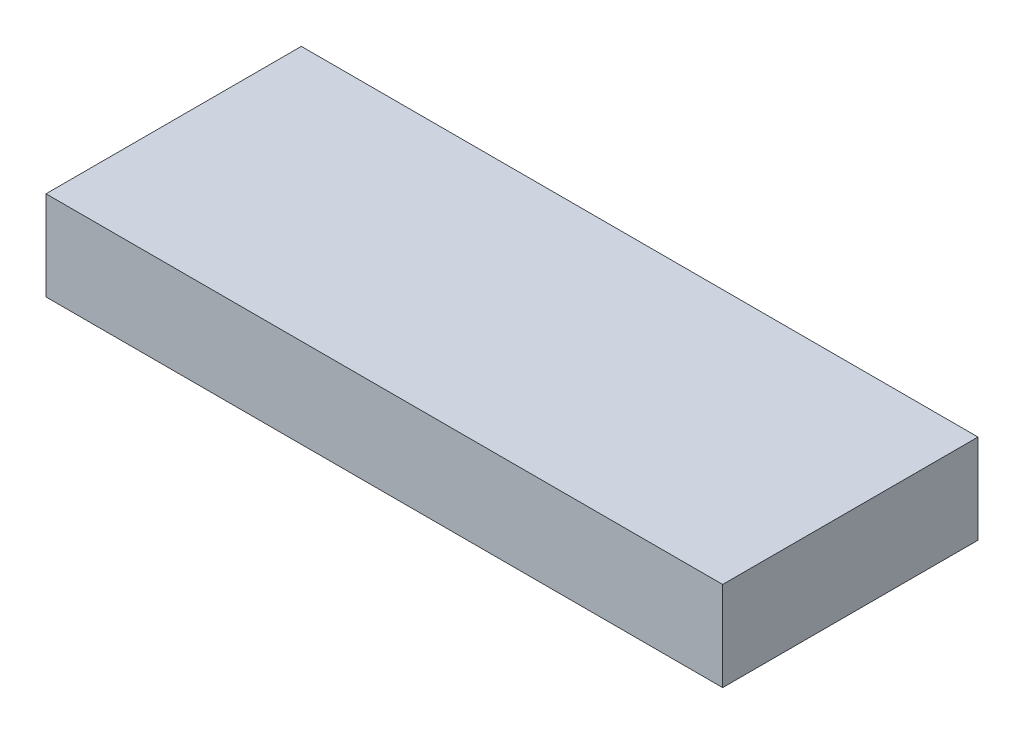
ISO-10303-21;
HEADER;
FILE_DESCRIPTION(('STEP AP214'),'2;1');
FILE_NAME('part.step','',(''),(''),'','','');
FILE_SCHEMA(('AUTOMOTIVE_DESIGN { 1 0 10303 214 1 1 1 1 }'));
ENDSEC;
DATA;
#1=APPLICATION_CONTEXT('core data for automotive mechanical design processes');
#2=APPLICATION_PROTOCOL_DEFINITION('international standard','automotive_design',2000,#1);
#3=PRODUCT_CONTEXT('',#1,'mechanical');
#4=PRODUCT('Part','Part','',(#3));
#5=PRODUCT_RELATED_PRODUCT_CATEGORY('part','',(#4));
#6=PRODUCT_DEFINITION_FORMATION('','',#4);
#7=PRODUCT_DEFINITION_CONTEXT('part definition',#1,'design');
#8=PRODUCT_DEFINITION('design','',#6,#7);
#9=PRODUCT_DEFINITION_SHAPE('','',#8);
#10=(LENGTH_UNIT() NAMED_UNIT(*) SI_UNIT(.MILLI.,.METRE.));
#11=(NAMED_UNIT(*) PLANE_ANGLE_UNIT() SI_UNIT($,.RADIAN.));
#12=(NAMED_UNIT(*) SI_UNIT($,.STERADIAN.) SOLID_ANGLE_UNIT());
#13=UNCERTAINTY_MEASURE_WITH_UNIT(LENGTH_MEASURE(1.E-05),#10,'distance_accuracy_value','');
#14=(GEOMETRIC_REPRESENTATION_CONTEXT(3) GLOBAL_UNCERTAINTY_ASSIGNED_CONTEXT((#13)) GLOBAL_UNIT_ASSIGNED_CONTEXT((#10,
#11,#12)) REPRESENTATION_CONTEXT('',''));
#15=CARTESIAN_POINT('',(0.,0.,0.));
#16=DIRECTION('',(0.,0.,1.));
#17=DIRECTION('',(1.,0.,0.));
#18=AXIS2_PLACEMENT_3D('',#15,#16,#17);
#19=CARTESIAN_POINT('',(0.,22.225,0.));
#20=DIRECTION('',(-1.,0.,0.));
#21=DIRECTION('',(0.,0.,1.));
#22=AXIS2_PLACEMENT_3D('',#19,#20,#21);
#23=PLANE('',#22);
#24=DIRECTION('',(0.,0.,-1.));
#25=VECTOR('',#24,1.);
#26=CARTESIAN_POINT('',(0.,0.,0.));
#27=LINE('',#26,#25);
#28=CARTESIAN_POINT('',(0.,0.,0.));
#29=VERTEX_POINT('',#28);
#30=CARTESIAN_POINT('',(0.,0.,-63.5));
#31=VERTEX_POINT('',#30);
#32=EDGE_CURVE('E98',#29,#31,#27,.T.);
#33=ORIENTED_EDGE('',*,*,#32,.F.);
#34=DIRECTION('',(0.,-1.,0.));
#35=VECTOR('',#34,1.);
#36=CARTESIAN_POINT('',(0.,22.225,0.));
#37=LINE('',#36,#35);
#38=CARTESIAN_POINT('',(0.,22.225,0.));
#39=VERTEX_POINT('',#38);
#40=EDGE_CURVE('E11',#39,#29,#37,.T.);
#41=ORIENTED_EDGE('',*,*,#40,.F.);
#42=DIRECTION('',(0.,0.,-1.));
#43=VECTOR('',#42,1.);
#44=CARTESIAN_POINT('',(0.,22.225,0.));
#45=LINE('',#44,#43);
#46=CARTESIAN_POINT('',(0.,22.225,-63.5));
#47=VERTEX_POINT('',#46);
#48=EDGE_CURVE('E93',#39,#47,#45,.T.);
#49=ORIENTED_EDGE('',*,*,#48,.T.);
#50=DIRECTION('',(0.,-1.,0.));
#51=VECTOR('',#50,1.);
#52=CARTESIAN_POINT('',(0.,22.225,-63.5));
#53=LINE('',#52,#51);
#54=EDGE_CURVE('E36',#47,#31,#53,.T.);
#55=ORIENTED_EDGE('',*,*,#54,.T.);
#56=EDGE_LOOP('',(#33,#41,#49,#55));
#57=FACE_BOUND('',#56,.T.);
#58=ADVANCED_FACE('F33',(#57),#23,.T.);
#59=CARTESIAN_POINT('',(0.,22.225,0.));
#60=DIRECTION('',(0.,0.,-1.));
#61=DIRECTION('',(-1.,0.,0.));
#62=AXIS2_PLACEMENT_3D('',#59,#60,#61);
#63=PLANE('',#62);
#64=DIRECTION('',(1.,0.,0.));
#65=VECTOR('',#64,1.);
#66=CARTESIAN_POINT('',(0.,0.,0.));
#67=LINE('',#66,#65);
#68=CARTESIAN_POINT('',(168.275,0.,0.));
#69=VERTEX_POINT('',#68);
#70=EDGE_CURVE('E66',#29,#69,#67,.T.);
#71=ORIENTED_EDGE('',*,*,#70,.T.);
#72=DIRECTION('',(0.,-1.,0.));
#73=VECTOR('',#72,1.);
#74=CARTESIAN_POINT('',(168.275,22.225,0.));
#75=LINE('',#74,#73);
#76=CARTESIAN_POINT('',(168.275,22.225,0.));
#77=VERTEX_POINT('',#76);
#78=EDGE_CURVE('E42',#77,#69,#75,.T.);
#79=ORIENTED_EDGE('',*,*,#78,.F.);
#80=DIRECTION('',(1.,0.,0.));
#81=VECTOR('',#80,1.);
#82=CARTESIAN_POINT('',(0.,22.225,0.));
#83=LINE('',#82,#81);
#84=EDGE_CURVE('E83',#39,#77,#83,.T.);
#85=ORIENTED_EDGE('',*,*,#84,.F.);
#86=ORIENTED_EDGE('',*,*,#40,.T.);
#87=EDGE_LOOP('',(#71,#79,#85,#86));
#88=FACE_BOUND('',#87,.T.);
#89=ADVANCED_FACE('F108',(#88),#63,.F.);
#90=CARTESIAN_POINT('',(168.275,22.225,0.));
#91=DIRECTION('',(-1.,0.,0.));
#92=DIRECTION('',(0.,0.,1.));
#93=AXIS2_PLACEMENT_3D('',#90,#91,#92);
#94=PLANE('',#93);
#95=DIRECTION('',(0.,0.,-1.));
#96=VECTOR('',#95,1.);
#97=CARTESIAN_POINT('',(168.275,0.,0.));
#98=LINE('',#97,#96);
#99=CARTESIAN_POINT('',(168.275,0.,-63.5));
#100=VERTEX_POINT('',#99);
#101=EDGE_CURVE('E90',#69,#100,#98,.T.);
#102=ORIENTED_EDGE('',*,*,#101,.T.);
#103=DIRECTION('',(0.,-1.,0.));
#104=VECTOR('',#103,1.);
#105=CARTESIAN_POINT('',(168.275,22.225,-63.5));
#106=LINE('',#105,#104);
#107=CARTESIAN_POINT('',(168.275,22.225,-63.5));
#108=VERTEX_POINT('',#107);
#109=EDGE_CURVE('E87',#108,#100,#106,.T.);
#110=ORIENTED_EDGE('',*,*,#109,.F.);
#111=DIRECTION('',(0.,0.,-1.));
#112=VECTOR('',#111,1.);
#113=CARTESIAN_POINT('',(168.275,22.225,0.));
#114=LINE('',#113,#112);
#115=EDGE_CURVE('E78',#77,#108,#114,.T.);
#116=ORIENTED_EDGE('',*,*,#115,.F.);
#117=ORIENTED_EDGE('',*,*,#78,.T.);
#118=EDGE_LOOP('',(#102,#110,#116,#117));
#119=FACE_BOUND('',#118,.T.);
#120=ADVANCED_FACE('F88',(#119),#94,.F.);
#121=CARTESIAN_POINT('',(0.,22.225,-63.5));
#122=DIRECTION('',(0.,0.,-1.));
#123=DIRECTION('',(-1.,0.,0.));
#124=AXIS2_PLACEMENT_3D('',#121,#122,#123);
#125=PLANE('',#124);
#126=DIRECTION('',(1.,0.,0.));
#127=VECTOR('',#126,1.);
#128=CARTESIAN_POINT('',(0.,0.,-63.5));
#129=LINE('',#128,#127);
#130=EDGE_CURVE('E101',#31,#100,#129,.T.);
#131=ORIENTED_EDGE('',*,*,#130,.F.);
#132=ORIENTED_EDGE('',*,*,#54,.F.);
#133=DIRECTION('',(1.,0.,0.));
#134=VECTOR('',#133,1.);
#135=CARTESIAN_POINT('',(0.,22.225,-63.5));
#136=LINE('',#135,#134);
#137=EDGE_CURVE('E82',#47,#108,#136,.T.);
#138=ORIENTED_EDGE('',*,*,#137,.T.);
#139=ORIENTED_EDGE('',*,*,#109,.T.);
#140=EDGE_LOOP('',(#131,#132,#138,#139));
#141=FACE_BOUND('',#140,.T.);
#142=ADVANCED_FACE('F92',(#141),#125,.T.);
#143=CARTESIAN_POINT('',(0.,22.225,0.));
#144=DIRECTION('',(0.,-1.,0.));
#145=DIRECTION('',(0.,0.,-1.));
#146=AXIS2_PLACEMENT_3D('',#143,#144,#145);
#147=PLANE('',#146);
#148=ORIENTED_EDGE('',*,*,#48,.F.);
#149=ORIENTED_EDGE('',*,*,#84,.T.);
#150=ORIENTED_EDGE('',*,*,#115,.T.);
#151=ORIENTED_EDGE('',*,*,#137,.F.);
#152=EDGE_LOOP('',(#148,#149,#150,#151));
#153=FACE_BOUND('',#152,.T.);
#154=ADVANCED_FACE('F81',(#153),#147,.F.);
#155=CARTESIAN_POINT('',(0.,0.,0.));
#156=DIRECTION('',(0.,-1.,0.));
#157=DIRECTION('',(0.,0.,-1.));
#158=AXIS2_PLACEMENT_3D('',#155,#156,#157);
#159=PLANE('',#158);
#160=ORIENTED_EDGE('',*,*,#32,.T.);
#161=ORIENTED_EDGE('',*,*,#130,.T.);
#162=ORIENTED_EDGE('',*,*,#101,.F.);
#163=ORIENTED_EDGE('',*,*,#70,.F.);
#164=EDGE_LOOP('',(#160,#161,#162,#163));
#165=FACE_BOUND('',#164,.T.);
#166=ADVANCED_FACE('F106',(#165),#159,.T.);
#167=CLOSED_SHELL('',(#58,#89,#120,#142,#154,#166));
#168=MANIFOLD_SOLID_BREP('B2',#167);
#169=ADVANCED_BREP_SHAPE_REPRESENTATION('',(#18,#168),#14);
#170=SHAPE_DEFINITION_REPRESENTATION(#9,#169);
ENDSEC;
END-ISO-10303-21;
